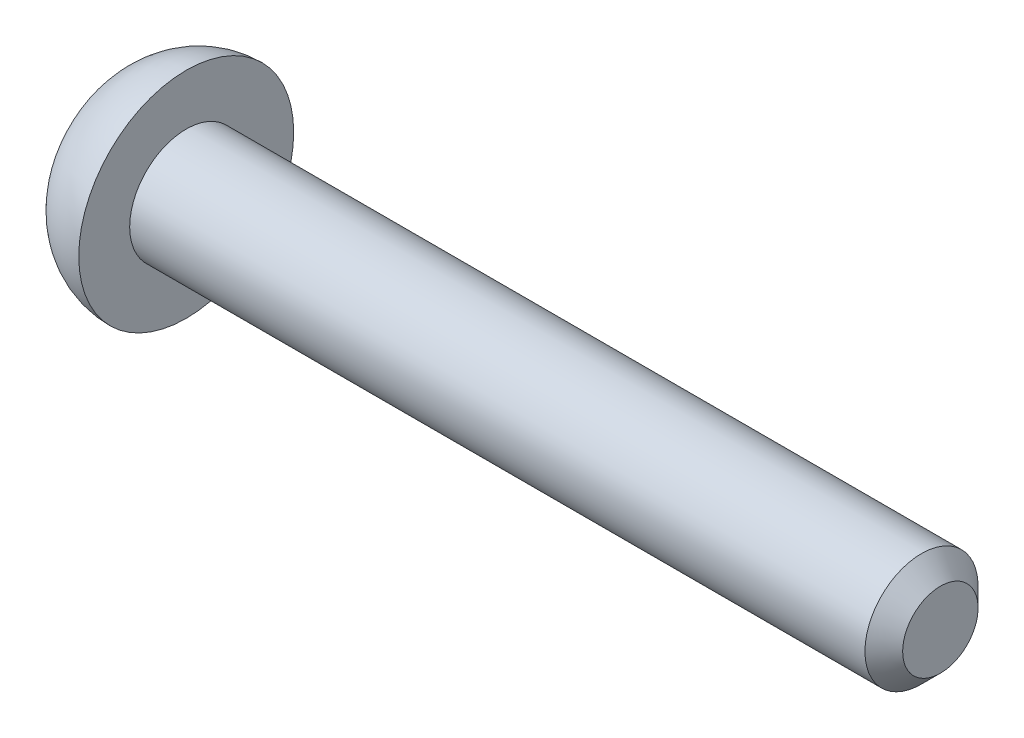
ISO-10303-21;
HEADER;
FILE_DESCRIPTION(('STEP AP214'),'2;1');
FILE_NAME('part.step','',(''),(''),'','','');
FILE_SCHEMA(('AUTOMOTIVE_DESIGN { 1 0 10303 214 1 1 1 1 }'));
ENDSEC;
DATA;
#1=APPLICATION_CONTEXT('core data for automotive mechanical design processes');
#2=APPLICATION_PROTOCOL_DEFINITION('international standard','automotive_design',2000,#1);
#3=PRODUCT_CONTEXT('',#1,'mechanical');
#4=PRODUCT('Part','Part','',(#3));
#5=PRODUCT_RELATED_PRODUCT_CATEGORY('part','',(#4));
#6=PRODUCT_DEFINITION_FORMATION('','',#4);
#7=PRODUCT_DEFINITION_CONTEXT('part definition',#1,'design');
#8=PRODUCT_DEFINITION('design','',#6,#7);
#9=PRODUCT_DEFINITION_SHAPE('','',#8);
#10=(LENGTH_UNIT() NAMED_UNIT(*) SI_UNIT(.MILLI.,.METRE.));
#11=(NAMED_UNIT(*) PLANE_ANGLE_UNIT() SI_UNIT($,.RADIAN.));
#12=(NAMED_UNIT(*) SI_UNIT($,.STERADIAN.) SOLID_ANGLE_UNIT());
#13=UNCERTAINTY_MEASURE_WITH_UNIT(LENGTH_MEASURE(1.E-05),#10,'distance_accuracy_value','');
#14=(GEOMETRIC_REPRESENTATION_CONTEXT(3) GLOBAL_UNCERTAINTY_ASSIGNED_CONTEXT((#13)) GLOBAL_UNIT_ASSIGNED_CONTEXT((#10,
#11,#12)) REPRESENTATION_CONTEXT('',''));
#15=CARTESIAN_POINT('',(0.,0.,0.));
#16=DIRECTION('',(0.,0.,1.));
#17=DIRECTION('',(1.,0.,0.));
#18=AXIS2_PLACEMENT_3D('',#15,#16,#17);
#19=CARTESIAN_POINT('',(-21.65,0.,-2.04903810567665));
#20=DIRECTION('',(1.,0.,0.));
#21=DIRECTION('',(0.,0.,-1.));
#22=AXIS2_PLACEMENT_3D('',#19,#20,#21);
#23=PLANE('',#22);
#24=CARTESIAN_POINT('',(-21.65,0.,0.));
#25=DIRECTION('',(-1.,0.,0.));
#26=DIRECTION('',(0.,0.,1.));
#27=AXIS2_PLACEMENT_3D('',#24,#25,#26);
#28=CIRCLE('',#27,2.04903810567665);
#29=CARTESIAN_POINT('',(-21.65,0.,2.04903810567665));
#30=VERTEX_POINT('',#29);
#31=EDGE_CURVE('E211',#30,#30,#28,.T.);
#32=ORIENTED_EDGE('',*,*,#31,.T.);
#33=EDGE_LOOP('',(#32));
#34=FACE_BOUND('',#33,.T.);
#35=CARTESIAN_POINT('',(-21.65,2.04903810567666,0.));
#36=DIRECTION('',(1.,0.,0.));
#37=DIRECTION('',(0.,0.,1.));
#38=AXIS2_PLACEMENT_3D('',#35,#36,#37);
#39=CIRCLE('',#38,1.02907378905691);
#40=CARTESIAN_POINT('',(-21.65,1.20759961003623,0.592430689092257));
#41=VERTEX_POINT('',#40);
#42=CARTESIAN_POINT('',(-21.65,1.20759961003623,-0.592430689092258));
#43=VERTEX_POINT('',#42);
#44=EDGE_CURVE('E157',#41,#43,#39,.T.);
#45=ORIENTED_EDGE('',*,*,#44,.F.);
#46=CARTESIAN_POINT('',(-21.65,1.12583302491977,0.650000000000001));
#47=DIRECTION('',(-1.,0.,0.));
#48=DIRECTION('',(0.,0.,1.));
#49=AXIS2_PLACEMENT_3D('',#46,#47,#48);
#50=CIRCLE('',#49,0.1);
#51=CARTESIAN_POINT('',(-21.65,1.11685983175353,0.74959659534543));
#52=VERTEX_POINT('',#51);
#53=EDGE_CURVE('E47',#52,#41,#50,.T.);
#54=ORIENTED_EDGE('',*,*,#53,.F.);
#55=CARTESIAN_POINT('',(-21.65,1.02451905283833,1.77451905283833));
#56=DIRECTION('',(1.,0.,0.));
#57=DIRECTION('',(0.,0.,1.));
#58=AXIS2_PLACEMENT_3D('',#55,#56,#57);
#59=CIRCLE('',#58,1.02907378905691);
#60=CARTESIAN_POINT('',(-21.65,0.0907397782827011,1.34202728443769));
#61=VERTEX_POINT('',#60);
#62=EDGE_CURVE('E184',#61,#52,#59,.T.);
#63=ORIENTED_EDGE('',*,*,#62,.F.);
#64=CARTESIAN_POINT('',(-21.65,0.,1.3));
#65=DIRECTION('',(-1.,0.,0.));
#66=DIRECTION('',(0.,0.,1.));
#67=AXIS2_PLACEMENT_3D('',#64,#65,#66);
#68=CIRCLE('',#67,0.1);
#69=CARTESIAN_POINT('',(-21.65,-0.0907397782827009,1.34202728443769));
#70=VERTEX_POINT('',#69);
#71=EDGE_CURVE('E182',#70,#61,#68,.T.);
#72=ORIENTED_EDGE('',*,*,#71,.F.);
#73=CARTESIAN_POINT('',(-21.65,-1.02451905283833,1.77451905283833));
#74=DIRECTION('',(1.,0.,0.));
#75=DIRECTION('',(0.,0.,1.));
#76=AXIS2_PLACEMENT_3D('',#73,#74,#75);
#77=CIRCLE('',#76,1.02907378905691);
#78=CARTESIAN_POINT('',(-21.65,-1.11685983175353,0.74959659534543));
#79=VERTEX_POINT('',#78);
#80=EDGE_CURVE('E131',#79,#70,#77,.T.);
#81=ORIENTED_EDGE('',*,*,#80,.F.);
#82=CARTESIAN_POINT('',(-21.65,-1.12583302491977,0.650000000000001));
#83=DIRECTION('',(-1.,0.,0.));
#84=DIRECTION('',(0.,0.,-1.));
#85=AXIS2_PLACEMENT_3D('',#82,#83,#84);
#86=CIRCLE('',#85,0.0999999999999997);
#87=CARTESIAN_POINT('',(-21.65,-1.20759961003623,0.592430689092258));
#88=VERTEX_POINT('',#87);
#89=EDGE_CURVE('E178',#88,#79,#86,.T.);
#90=ORIENTED_EDGE('',*,*,#89,.F.);
#91=CARTESIAN_POINT('',(-21.65,-2.04903810567666,0.));
#92=DIRECTION('',(1.,0.,0.));
#93=DIRECTION('',(0.,0.,-1.));
#94=AXIS2_PLACEMENT_3D('',#91,#92,#93);
#95=CIRCLE('',#94,1.02907378905691);
#96=CARTESIAN_POINT('',(-21.65,-1.20759961003623,-0.592430689092258));
#97=VERTEX_POINT('',#96);
#98=EDGE_CURVE('E175',#97,#88,#95,.T.);
#99=ORIENTED_EDGE('',*,*,#98,.F.);
#100=CARTESIAN_POINT('',(-21.65,-1.12583302491977,-0.650000000000001));
#101=DIRECTION('',(-1.,0.,0.));
#102=DIRECTION('',(0.,0.,1.));
#103=AXIS2_PLACEMENT_3D('',#100,#101,#102);
#104=CIRCLE('',#103,0.0999999999999999);
#105=CARTESIAN_POINT('',(-21.65,-1.11685983175353,-0.749596595345431));
#106=VERTEX_POINT('',#105);
#107=EDGE_CURVE('E172',#106,#97,#104,.T.);
#108=ORIENTED_EDGE('',*,*,#107,.F.);
#109=CARTESIAN_POINT('',(-21.65,-1.02451905283833,-1.77451905283833));
#110=DIRECTION('',(1.,0.,0.));
#111=DIRECTION('',(0.,0.,1.));
#112=AXIS2_PLACEMENT_3D('',#109,#110,#111);
#113=CIRCLE('',#112,1.02907378905691);
#114=CARTESIAN_POINT('',(-21.65,-0.0907397782827007,-1.34202728443769));
#115=VERTEX_POINT('',#114);
#116=EDGE_CURVE('E169',#115,#106,#113,.T.);
#117=ORIENTED_EDGE('',*,*,#116,.F.);
#118=CARTESIAN_POINT('',(-21.65,0.,-1.3));
#119=DIRECTION('',(-1.,0.,0.));
#120=DIRECTION('',(0.,0.,1.));
#121=AXIS2_PLACEMENT_3D('',#118,#119,#120);
#122=CIRCLE('',#121,0.1);
#123=CARTESIAN_POINT('',(-21.65,0.0907397782827007,-1.34202728443769));
#124=VERTEX_POINT('',#123);
#125=EDGE_CURVE('E166',#124,#115,#122,.T.);
#126=ORIENTED_EDGE('',*,*,#125,.F.);
#127=CARTESIAN_POINT('',(-21.65,1.02451905283833,-1.77451905283833));
#128=DIRECTION('',(1.,0.,0.));
#129=DIRECTION('',(0.,0.,1.));
#130=AXIS2_PLACEMENT_3D('',#127,#128,#129);
#131=CIRCLE('',#130,1.02907378905691);
#132=CARTESIAN_POINT('',(-21.65,1.11685983175353,-0.74959659534543));
#133=VERTEX_POINT('',#132);
#134=EDGE_CURVE('E163',#133,#124,#131,.T.);
#135=ORIENTED_EDGE('',*,*,#134,.F.);
#136=CARTESIAN_POINT('',(-21.65,1.12583302491977,-0.650000000000001));
#137=DIRECTION('',(-1.,0.,0.));
#138=DIRECTION('',(0.,0.,-1.));
#139=AXIS2_PLACEMENT_3D('',#136,#137,#138);
#140=CIRCLE('',#139,0.0999999999999998);
#141=EDGE_CURVE('E160',#43,#133,#140,.T.);
#142=ORIENTED_EDGE('',*,*,#141,.F.);
#143=EDGE_LOOP('',(#45,#54,#63,#72,#81,#90,#99,#108,#117,#126,#135,#142));
#144=FACE_BOUND('',#143,.T.);
#145=ADVANCED_FACE('F32',(#34,#144),#23,.F.);
#146=CARTESIAN_POINT('',(-20.,0.,0.));
#147=DIRECTION('',(-1.,0.,0.));
#148=DIRECTION('',(0.,0.,1.));
#149=AXIS2_PLACEMENT_3D('',#146,#147,#148);
#150=DEGENERATE_TOROIDAL_SURFACE('',#149,0.749999999999999,2.1,.T.);
#151=ORIENTED_EDGE('',*,*,#31,.F.);
#152=EDGE_LOOP('',(#151));
#153=FACE_BOUND('',#152,.T.);
#154=CARTESIAN_POINT('',(-20.,0.,0.));
#155=DIRECTION('',(-1.,0.,0.));
#156=DIRECTION('',(0.,0.,1.));
#157=AXIS2_PLACEMENT_3D('',#154,#155,#156);
#158=CIRCLE('',#157,2.85);
#159=CARTESIAN_POINT('',(-20.,0.,2.85));
#160=VERTEX_POINT('',#159);
#161=EDGE_CURVE('E208',#160,#160,#158,.T.);
#162=ORIENTED_EDGE('',*,*,#161,.T.);
#163=EDGE_LOOP('',(#162));
#164=FACE_BOUND('',#163,.T.);
#165=ADVANCED_FACE('F233',(#153,#164),#150,.T.);
#166=CARTESIAN_POINT('',(-20.,0.,-2.85));
#167=DIRECTION('',(-1.,0.,0.));
#168=DIRECTION('',(0.,0.,1.));
#169=AXIS2_PLACEMENT_3D('',#166,#167,#168);
#170=PLANE('',#169);
#171=ORIENTED_EDGE('',*,*,#161,.F.);
#172=EDGE_LOOP('',(#171));
#173=FACE_BOUND('',#172,.T.);
#174=CARTESIAN_POINT('',(-20.,0.,0.));
#175=DIRECTION('',(-1.,0.,0.));
#176=DIRECTION('',(0.,0.,1.));
#177=AXIS2_PLACEMENT_3D('',#174,#175,#176);
#178=CIRCLE('',#177,1.5);
#179=CARTESIAN_POINT('',(-20.,0.,1.5));
#180=VERTEX_POINT('',#179);
#181=EDGE_CURVE('E188',#180,#180,#178,.T.);
#182=ORIENTED_EDGE('',*,*,#181,.T.);
#183=EDGE_LOOP('',(#182));
#184=FACE_BOUND('',#183,.T.);
#185=ADVANCED_FACE('F238',(#173,#184),#170,.F.);
#186=CARTESIAN_POINT('',(-21.65,0.,0.));
#187=DIRECTION('',(-1.,0.,0.));
#188=DIRECTION('',(0.,0.,1.));
#189=AXIS2_PLACEMENT_3D('',#186,#187,#188);
#190=CYLINDRICAL_SURFACE('',#189,1.5);
#191=CARTESIAN_POINT('',(-0.5,0.,0.));
#192=DIRECTION('',(-1.,0.,0.));
#193=DIRECTION('',(0.,0.,1.));
#194=AXIS2_PLACEMENT_3D('',#191,#192,#193);
#195=CIRCLE('',#194,1.5);
#196=CARTESIAN_POINT('',(-0.5,0.,1.5));
#197=VERTEX_POINT('',#196);
#198=EDGE_CURVE('E40',#197,#197,#195,.T.);
#199=ORIENTED_EDGE('',*,*,#198,.T.);
#200=EDGE_LOOP('',(#199));
#201=FACE_BOUND('',#200,.T.);
#202=ORIENTED_EDGE('',*,*,#181,.F.);
#203=EDGE_LOOP('',(#202));
#204=FACE_BOUND('',#203,.T.);
#205=ADVANCED_FACE('F216',(#201,#204),#190,.T.);
#206=CARTESIAN_POINT('',(0.,0.,0.));
#207=DIRECTION('',(-1.,0.,0.));
#208=DIRECTION('',(0.,0.,1.));
#209=AXIS2_PLACEMENT_3D('',#206,#207,#208);
#210=PLANE('',#209);
#211=CARTESIAN_POINT('',(0.,0.,0.));
#212=DIRECTION('',(-1.,0.,0.));
#213=DIRECTION('',(0.,0.,1.));
#214=AXIS2_PLACEMENT_3D('',#211,#212,#213);
#215=CIRCLE('',#214,0.999999999999996);
#216=CARTESIAN_POINT('',(0.,0.,0.999999999999996));
#217=VERTEX_POINT('',#216);
#218=EDGE_CURVE('E11',#217,#217,#215,.F.);
#219=ORIENTED_EDGE('',*,*,#218,.T.);
#220=EDGE_LOOP('',(#219));
#221=FACE_BOUND('',#220,.T.);
#222=ADVANCED_FACE('F221',(#221),#210,.F.);
#223=CARTESIAN_POINT('',(-0.5,0.,0.));
#224=DIRECTION('',(-1.,0.,0.));
#225=DIRECTION('',(0.,0.,1.));
#226=AXIS2_PLACEMENT_3D('',#223,#224,#225);
#227=CONICAL_SURFACE('',#226,1.5,0.785398163397451);
#228=ORIENTED_EDGE('',*,*,#218,.F.);
#229=EDGE_LOOP('',(#228));
#230=FACE_BOUND('',#229,.T.);
#231=ORIENTED_EDGE('',*,*,#198,.F.);
#232=EDGE_LOOP('',(#231));
#233=FACE_BOUND('',#232,.T.);
#234=ADVANCED_FACE('F34',(#230,#233),#227,.T.);
#235=CARTESIAN_POINT('',(-20.65,1.12583302491977,0.650000000000001));
#236=DIRECTION('',(-1.,0.,0.));
#237=DIRECTION('',(0.,0.,1.));
#238=AXIS2_PLACEMENT_3D('',#235,#236,#237);
#239=CYLINDRICAL_SURFACE('',#238,0.1);
#240=ORIENTED_EDGE('',*,*,#53,.T.);
#241=DIRECTION('',(-1.,0.,0.));
#242=VECTOR('',#241,1.);
#243=CARTESIAN_POINT('',(-20.65,1.20759961003623,0.592430689092257));
#244=LINE('',#243,#242);
#245=CARTESIAN_POINT('',(-20.65,1.20759961003623,0.592430689092257));
#246=VERTEX_POINT('',#245);
#247=EDGE_CURVE('E95',#246,#41,#244,.T.);
#248=ORIENTED_EDGE('',*,*,#247,.F.);
#249=CARTESIAN_POINT('',(-20.65,1.12583302491977,0.650000000000001));
#250=DIRECTION('',(-1.,0.,0.));
#251=DIRECTION('',(0.,0.,1.));
#252=AXIS2_PLACEMENT_3D('',#249,#250,#251);
#253=CIRCLE('',#252,0.1);
#254=CARTESIAN_POINT('',(-20.65,1.11685983175353,0.74959659534543));
#255=VERTEX_POINT('',#254);
#256=EDGE_CURVE('E186',#255,#246,#253,.T.);
#257=ORIENTED_EDGE('',*,*,#256,.F.);
#258=DIRECTION('',(-1.,0.,0.));
#259=VECTOR('',#258,1.);
#260=CARTESIAN_POINT('',(-20.65,1.11685983175353,0.74959659534543));
#261=LINE('',#260,#259);
#262=EDGE_CURVE('E55',#255,#52,#261,.T.);
#263=ORIENTED_EDGE('',*,*,#262,.T.);
#264=EDGE_LOOP('',(#240,#248,#257,#263));
#265=FACE_BOUND('',#264,.T.);
#266=ADVANCED_FACE('F220',(#265),#239,.F.);
#267=CARTESIAN_POINT('',(-20.65,1.02451905283833,1.77451905283833));
#268=DIRECTION('',(-1.,0.,0.));
#269=DIRECTION('',(0.,0.,1.));
#270=AXIS2_PLACEMENT_3D('',#267,#268,#269);
#271=CYLINDRICAL_SURFACE('',#270,1.02907378905691);
#272=ORIENTED_EDGE('',*,*,#62,.T.);
#273=ORIENTED_EDGE('',*,*,#262,.F.);
#274=CARTESIAN_POINT('',(-20.65,1.02451905283833,1.77451905283833));
#275=DIRECTION('',(1.,0.,0.));
#276=DIRECTION('',(0.,0.,1.));
#277=AXIS2_PLACEMENT_3D('',#274,#275,#276);
#278=CIRCLE('',#277,1.02907378905691);
#279=CARTESIAN_POINT('',(-20.65,0.0907397782827011,1.34202728443769));
#280=VERTEX_POINT('',#279);
#281=EDGE_CURVE('E143',#280,#255,#278,.T.);
#282=ORIENTED_EDGE('',*,*,#281,.F.);
#283=DIRECTION('',(-1.,0.,0.));
#284=VECTOR('',#283,1.);
#285=CARTESIAN_POINT('',(-20.65,0.0907397782827011,1.34202728443769));
#286=LINE('',#285,#284);
#287=EDGE_CURVE('E135',#280,#61,#286,.T.);
#288=ORIENTED_EDGE('',*,*,#287,.T.);
#289=EDGE_LOOP('',(#272,#273,#282,#288));
#290=FACE_BOUND('',#289,.T.);
#291=ADVANCED_FACE('F227',(#290),#271,.T.);
#292=CARTESIAN_POINT('',(-20.65,0.,1.3));
#293=DIRECTION('',(-1.,0.,0.));
#294=DIRECTION('',(0.,0.,1.));
#295=AXIS2_PLACEMENT_3D('',#292,#293,#294);
#296=CYLINDRICAL_SURFACE('',#295,0.1);
#297=ORIENTED_EDGE('',*,*,#71,.T.);
#298=ORIENTED_EDGE('',*,*,#287,.F.);
#299=CARTESIAN_POINT('',(-20.65,0.,1.3));
#300=DIRECTION('',(-1.,0.,0.));
#301=DIRECTION('',(0.,0.,1.));
#302=AXIS2_PLACEMENT_3D('',#299,#300,#301);
#303=CIRCLE('',#302,0.1);
#304=CARTESIAN_POINT('',(-20.65,-0.0907397782827009,1.34202728443769));
#305=VERTEX_POINT('',#304);
#306=EDGE_CURVE('E139',#305,#280,#303,.T.);
#307=ORIENTED_EDGE('',*,*,#306,.F.);
#308=DIRECTION('',(-1.,0.,0.));
#309=VECTOR('',#308,1.);
#310=CARTESIAN_POINT('',(-20.65,-0.0907397782827009,1.34202728443769));
#311=LINE('',#310,#309);
#312=EDGE_CURVE('E124',#305,#70,#311,.T.);
#313=ORIENTED_EDGE('',*,*,#312,.T.);
#314=EDGE_LOOP('',(#297,#298,#307,#313));
#315=FACE_BOUND('',#314,.T.);
#316=ADVANCED_FACE('F140',(#315),#296,.F.);
#317=CARTESIAN_POINT('',(-20.65,-1.02451905283833,1.77451905283833));
#318=DIRECTION('',(-1.,0.,0.));
#319=DIRECTION('',(0.,0.,1.));
#320=AXIS2_PLACEMENT_3D('',#317,#318,#319);
#321=CYLINDRICAL_SURFACE('',#320,1.02907378905691);
#322=ORIENTED_EDGE('',*,*,#80,.T.);
#323=ORIENTED_EDGE('',*,*,#312,.F.);
#324=CARTESIAN_POINT('',(-20.65,-1.02451905283833,1.77451905283833));
#325=DIRECTION('',(1.,0.,0.));
#326=DIRECTION('',(0.,0.,1.));
#327=AXIS2_PLACEMENT_3D('',#324,#325,#326);
#328=CIRCLE('',#327,1.02907378905691);
#329=CARTESIAN_POINT('',(-20.65,-1.11685983175353,0.74959659534543));
#330=VERTEX_POINT('',#329);
#331=EDGE_CURVE('E128',#330,#305,#328,.T.);
#332=ORIENTED_EDGE('',*,*,#331,.F.);
#333=DIRECTION('',(-1.,0.,0.));
#334=VECTOR('',#333,1.);
#335=CARTESIAN_POINT('',(-20.65,-1.11685983175353,0.74959659534543));
#336=LINE('',#335,#334);
#337=EDGE_CURVE('E136',#330,#79,#336,.T.);
#338=ORIENTED_EDGE('',*,*,#337,.T.);
#339=EDGE_LOOP('',(#322,#323,#332,#338));
#340=FACE_BOUND('',#339,.T.);
#341=ADVANCED_FACE('F126',(#340),#321,.T.);
#342=CARTESIAN_POINT('',(-20.65,-1.12583302491977,0.650000000000001));
#343=DIRECTION('',(-1.,0.,0.));
#344=DIRECTION('',(0.,0.,1.));
#345=AXIS2_PLACEMENT_3D('',#342,#343,#344);
#346=CYLINDRICAL_SURFACE('',#345,0.0999999999999997);
#347=ORIENTED_EDGE('',*,*,#89,.T.);
#348=ORIENTED_EDGE('',*,*,#337,.F.);
#349=CARTESIAN_POINT('',(-20.65,-1.12583302491977,0.650000000000001));
#350=DIRECTION('',(-1.,0.,0.));
#351=DIRECTION('',(0.,0.,-1.));
#352=AXIS2_PLACEMENT_3D('',#349,#350,#351);
#353=CIRCLE('',#352,0.0999999999999997);
#354=CARTESIAN_POINT('',(-20.65,-1.20759961003623,0.592430689092258));
#355=VERTEX_POINT('',#354);
#356=EDGE_CURVE('E149',#355,#330,#353,.T.);
#357=ORIENTED_EDGE('',*,*,#356,.F.);
#358=DIRECTION('',(-1.,0.,0.));
#359=VECTOR('',#358,1.);
#360=CARTESIAN_POINT('',(-20.65,-1.20759961003623,0.592430689092258));
#361=LINE('',#360,#359);
#362=EDGE_CURVE('E191',#355,#88,#361,.T.);
#363=ORIENTED_EDGE('',*,*,#362,.T.);
#364=EDGE_LOOP('',(#347,#348,#357,#363));
#365=FACE_BOUND('',#364,.T.);
#366=ADVANCED_FACE('F275',(#365),#346,.F.);
#367=CARTESIAN_POINT('',(-20.65,-2.04903810567666,0.));
#368=DIRECTION('',(-1.,0.,0.));
#369=DIRECTION('',(0.,0.,1.));
#370=AXIS2_PLACEMENT_3D('',#367,#368,#369);
#371=CYLINDRICAL_SURFACE('',#370,1.02907378905691);
#372=ORIENTED_EDGE('',*,*,#98,.T.);
#373=ORIENTED_EDGE('',*,*,#362,.F.);
#374=CARTESIAN_POINT('',(-20.65,-2.04903810567666,0.));
#375=DIRECTION('',(1.,0.,0.));
#376=DIRECTION('',(0.,0.,-1.));
#377=AXIS2_PLACEMENT_3D('',#374,#375,#376);
#378=CIRCLE('',#377,1.02907378905691);
#379=CARTESIAN_POINT('',(-20.65,-1.20759961003623,-0.592430689092258));
#380=VERTEX_POINT('',#379);
#381=EDGE_CURVE('E151',#380,#355,#378,.T.);
#382=ORIENTED_EDGE('',*,*,#381,.F.);
#383=DIRECTION('',(-1.,0.,0.));
#384=VECTOR('',#383,1.);
#385=CARTESIAN_POINT('',(-20.65,-1.20759961003623,-0.592430689092258));
#386=LINE('',#385,#384);
#387=EDGE_CURVE('E193',#380,#97,#386,.T.);
#388=ORIENTED_EDGE('',*,*,#387,.T.);
#389=EDGE_LOOP('',(#372,#373,#382,#388));
#390=FACE_BOUND('',#389,.T.);
#391=ADVANCED_FACE('F271',(#390),#371,.T.);
#392=CARTESIAN_POINT('',(-20.65,-1.12583302491977,-0.650000000000001));
#393=DIRECTION('',(-1.,0.,0.));
#394=DIRECTION('',(0.,0.,1.));
#395=AXIS2_PLACEMENT_3D('',#392,#393,#394);
#396=CYLINDRICAL_SURFACE('',#395,0.0999999999999999);
#397=ORIENTED_EDGE('',*,*,#107,.T.);
#398=ORIENTED_EDGE('',*,*,#387,.F.);
#399=CARTESIAN_POINT('',(-20.65,-1.12583302491977,-0.650000000000001));
#400=DIRECTION('',(-1.,0.,0.));
#401=DIRECTION('',(0.,0.,1.));
#402=AXIS2_PLACEMENT_3D('',#399,#400,#401);
#403=CIRCLE('',#402,0.0999999999999999);
#404=CARTESIAN_POINT('',(-20.65,-1.11685983175353,-0.749596595345431));
#405=VERTEX_POINT('',#404);
#406=EDGE_CURVE('E419',#405,#380,#403,.T.);
#407=ORIENTED_EDGE('',*,*,#406,.F.);
#408=DIRECTION('',(-1.,0.,0.));
#409=VECTOR('',#408,1.);
#410=CARTESIAN_POINT('',(-20.65,-1.11685983175353,-0.749596595345431));
#411=LINE('',#410,#409);
#412=EDGE_CURVE('E195',#405,#106,#411,.T.);
#413=ORIENTED_EDGE('',*,*,#412,.T.);
#414=EDGE_LOOP('',(#397,#398,#407,#413));
#415=FACE_BOUND('',#414,.T.);
#416=ADVANCED_FACE('F267',(#415),#396,.F.);
#417=CARTESIAN_POINT('',(-20.65,-1.02451905283833,-1.77451905283833));
#418=DIRECTION('',(-1.,0.,0.));
#419=DIRECTION('',(0.,0.,1.));
#420=AXIS2_PLACEMENT_3D('',#417,#418,#419);
#421=CYLINDRICAL_SURFACE('',#420,1.02907378905691);
#422=ORIENTED_EDGE('',*,*,#116,.T.);
#423=ORIENTED_EDGE('',*,*,#412,.F.);
#424=CARTESIAN_POINT('',(-20.65,-1.02451905283833,-1.77451905283833));
#425=DIRECTION('',(1.,0.,0.));
#426=DIRECTION('',(0.,0.,1.));
#427=AXIS2_PLACEMENT_3D('',#424,#425,#426);
#428=CIRCLE('',#427,1.02907378905691);
#429=CARTESIAN_POINT('',(-20.65,-0.0907397782827007,-1.34202728443769));
#430=VERTEX_POINT('',#429);
#431=EDGE_CURVE('E416',#430,#405,#428,.T.);
#432=ORIENTED_EDGE('',*,*,#431,.F.);
#433=DIRECTION('',(-1.,0.,0.));
#434=VECTOR('',#433,1.);
#435=CARTESIAN_POINT('',(-20.65,-0.0907397782827007,-1.34202728443769));
#436=LINE('',#435,#434);
#437=EDGE_CURVE('E197',#430,#115,#436,.T.);
#438=ORIENTED_EDGE('',*,*,#437,.T.);
#439=EDGE_LOOP('',(#422,#423,#432,#438));
#440=FACE_BOUND('',#439,.T.);
#441=ADVANCED_FACE('F263',(#440),#421,.T.);
#442=CARTESIAN_POINT('',(-20.65,0.,-1.3));
#443=DIRECTION('',(-1.,0.,0.));
#444=DIRECTION('',(0.,0.,1.));
#445=AXIS2_PLACEMENT_3D('',#442,#443,#444);
#446=CYLINDRICAL_SURFACE('',#445,0.1);
#447=ORIENTED_EDGE('',*,*,#125,.T.);
#448=ORIENTED_EDGE('',*,*,#437,.F.);
#449=CARTESIAN_POINT('',(-20.65,0.,-1.3));
#450=DIRECTION('',(-1.,0.,0.));
#451=DIRECTION('',(0.,0.,1.));
#452=AXIS2_PLACEMENT_3D('',#449,#450,#451);
#453=CIRCLE('',#452,0.1);
#454=CARTESIAN_POINT('',(-20.65,0.0907397782827007,-1.34202728443769));
#455=VERTEX_POINT('',#454);
#456=EDGE_CURVE('E413',#455,#430,#453,.T.);
#457=ORIENTED_EDGE('',*,*,#456,.F.);
#458=DIRECTION('',(-1.,0.,0.));
#459=VECTOR('',#458,1.);
#460=CARTESIAN_POINT('',(-20.65,0.0907397782827007,-1.34202728443769));
#461=LINE('',#460,#459);
#462=EDGE_CURVE('E199',#455,#124,#461,.T.);
#463=ORIENTED_EDGE('',*,*,#462,.T.);
#464=EDGE_LOOP('',(#447,#448,#457,#463));
#465=FACE_BOUND('',#464,.T.);
#466=ADVANCED_FACE('F259',(#465),#446,.F.);
#467=CARTESIAN_POINT('',(-20.65,1.02451905283833,-1.77451905283833));
#468=DIRECTION('',(-1.,0.,0.));
#469=DIRECTION('',(0.,0.,1.));
#470=AXIS2_PLACEMENT_3D('',#467,#468,#469);
#471=CYLINDRICAL_SURFACE('',#470,1.02907378905691);
#472=ORIENTED_EDGE('',*,*,#134,.T.);
#473=ORIENTED_EDGE('',*,*,#462,.F.);
#474=CARTESIAN_POINT('',(-20.65,1.02451905283833,-1.77451905283833));
#475=DIRECTION('',(1.,0.,0.));
#476=DIRECTION('',(0.,0.,1.));
#477=AXIS2_PLACEMENT_3D('',#474,#475,#476);
#478=CIRCLE('',#477,1.02907378905691);
#479=CARTESIAN_POINT('',(-20.65,1.11685983175353,-0.74959659534543));
#480=VERTEX_POINT('',#479);
#481=EDGE_CURVE('E410',#480,#455,#478,.T.);
#482=ORIENTED_EDGE('',*,*,#481,.F.);
#483=DIRECTION('',(-1.,0.,0.));
#484=VECTOR('',#483,1.);
#485=CARTESIAN_POINT('',(-20.65,1.11685983175353,-0.74959659534543));
#486=LINE('',#485,#484);
#487=EDGE_CURVE('E201',#480,#133,#486,.T.);
#488=ORIENTED_EDGE('',*,*,#487,.T.);
#489=EDGE_LOOP('',(#472,#473,#482,#488));
#490=FACE_BOUND('',#489,.T.);
#491=ADVANCED_FACE('F255',(#490),#471,.T.);
#492=CARTESIAN_POINT('',(-20.65,1.12583302491977,-0.650000000000001));
#493=DIRECTION('',(-1.,0.,0.));
#494=DIRECTION('',(0.,0.,1.));
#495=AXIS2_PLACEMENT_3D('',#492,#493,#494);
#496=CYLINDRICAL_SURFACE('',#495,0.0999999999999998);
#497=ORIENTED_EDGE('',*,*,#141,.T.);
#498=ORIENTED_EDGE('',*,*,#487,.F.);
#499=CARTESIAN_POINT('',(-20.65,1.12583302491977,-0.650000000000001));
#500=DIRECTION('',(-1.,0.,0.));
#501=DIRECTION('',(0.,0.,-1.));
#502=AXIS2_PLACEMENT_3D('',#499,#500,#501);
#503=CIRCLE('',#502,0.0999999999999998);
#504=CARTESIAN_POINT('',(-20.65,1.20759961003623,-0.592430689092258));
#505=VERTEX_POINT('',#504);
#506=EDGE_CURVE('E405',#505,#480,#503,.T.);
#507=ORIENTED_EDGE('',*,*,#506,.F.);
#508=DIRECTION('',(-1.,0.,0.));
#509=VECTOR('',#508,1.);
#510=CARTESIAN_POINT('',(-20.65,1.20759961003623,-0.592430689092258));
#511=LINE('',#510,#509);
#512=EDGE_CURVE('E203',#505,#43,#511,.T.);
#513=ORIENTED_EDGE('',*,*,#512,.T.);
#514=EDGE_LOOP('',(#497,#498,#507,#513));
#515=FACE_BOUND('',#514,.T.);
#516=ADVANCED_FACE('F251',(#515),#496,.F.);
#517=CARTESIAN_POINT('',(-20.65,2.04903810567666,0.));
#518=DIRECTION('',(-1.,0.,0.));
#519=DIRECTION('',(0.,0.,1.));
#520=AXIS2_PLACEMENT_3D('',#517,#518,#519);
#521=CYLINDRICAL_SURFACE('',#520,1.02907378905691);
#522=ORIENTED_EDGE('',*,*,#44,.T.);
#523=ORIENTED_EDGE('',*,*,#512,.F.);
#524=CARTESIAN_POINT('',(-20.65,2.04903810567666,0.));
#525=DIRECTION('',(1.,0.,0.));
#526=DIRECTION('',(0.,0.,1.));
#527=AXIS2_PLACEMENT_3D('',#524,#525,#526);
#528=CIRCLE('',#527,1.02907378905691);
#529=EDGE_CURVE('E403',#246,#505,#528,.T.);
#530=ORIENTED_EDGE('',*,*,#529,.F.);
#531=ORIENTED_EDGE('',*,*,#247,.T.);
#532=EDGE_LOOP('',(#522,#523,#530,#531));
#533=FACE_BOUND('',#532,.T.);
#534=ADVANCED_FACE('F248',(#533),#521,.T.);
#535=CARTESIAN_POINT('',(-20.65,1.58743556529821,0.325));
#536=DIRECTION('',(-1.,0.,0.));
#537=DIRECTION('',(0.,0.,1.));
#538=AXIS2_PLACEMENT_3D('',#535,#536,#537);
#539=PLANE('',#538);
#540=ORIENTED_EDGE('',*,*,#256,.T.);
#541=ORIENTED_EDGE('',*,*,#529,.T.);
#542=ORIENTED_EDGE('',*,*,#506,.T.);
#543=ORIENTED_EDGE('',*,*,#481,.T.);
#544=ORIENTED_EDGE('',*,*,#456,.T.);
#545=ORIENTED_EDGE('',*,*,#431,.T.);
#546=ORIENTED_EDGE('',*,*,#406,.T.);
#547=ORIENTED_EDGE('',*,*,#381,.T.);
#548=ORIENTED_EDGE('',*,*,#356,.T.);
#549=ORIENTED_EDGE('',*,*,#331,.T.);
#550=ORIENTED_EDGE('',*,*,#306,.T.);
#551=ORIENTED_EDGE('',*,*,#281,.T.);
#552=EDGE_LOOP('',(#540,#541,#542,#543,#544,#545,#546,#547,#548,#549,#550,#551));
#553=FACE_BOUND('',#552,.T.);
#554=ADVANCED_FACE('F146',(#553),#539,.T.);
#555=CLOSED_SHELL('',(#145,#165,#185,#205,#222,#234,#266,#291,#316,#341,#366,#391,#416,#441,
#466,#491,#516,#534,#554));
#556=MANIFOLD_SOLID_BREP('B2',#555);
#557=ADVANCED_BREP_SHAPE_REPRESENTATION('',(#18,#556),#14);
#558=SHAPE_DEFINITION_REPRESENTATION(#9,#557);
ENDSEC;
END-ISO-10303-21;
